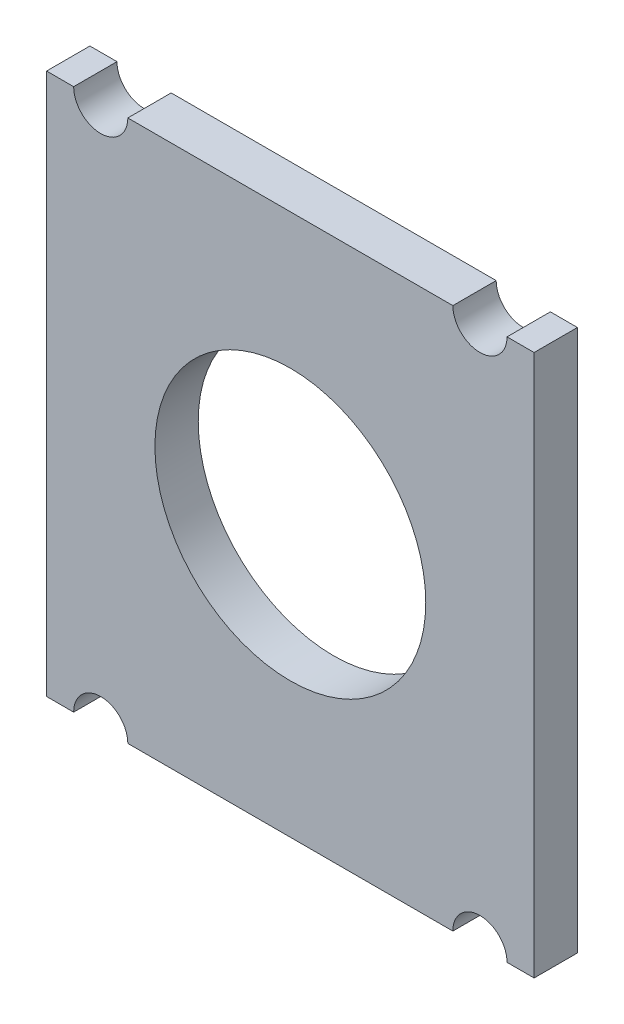
ISO-10303-21;
HEADER;
FILE_DESCRIPTION(('STEP AP214'),'2;1');
FILE_NAME('part.step','',(''),(''),'','','');
FILE_SCHEMA(('AUTOMOTIVE_DESIGN { 1 0 10303 214 1 1 1 1 }'));
ENDSEC;
DATA;
#1=APPLICATION_CONTEXT('core data for automotive mechanical design processes');
#2=APPLICATION_PROTOCOL_DEFINITION('international standard','automotive_design',2000,#1);
#3=PRODUCT_CONTEXT('',#1,'mechanical');
#4=PRODUCT('Part','Part','',(#3));
#5=PRODUCT_RELATED_PRODUCT_CATEGORY('part','',(#4));
#6=PRODUCT_DEFINITION_FORMATION('','',#4);
#7=PRODUCT_DEFINITION_CONTEXT('part definition',#1,'design');
#8=PRODUCT_DEFINITION('design','',#6,#7);
#9=PRODUCT_DEFINITION_SHAPE('','',#8);
#10=(LENGTH_UNIT() NAMED_UNIT(*) SI_UNIT(.MILLI.,.METRE.));
#11=(NAMED_UNIT(*) PLANE_ANGLE_UNIT() SI_UNIT($,.RADIAN.));
#12=(NAMED_UNIT(*) SI_UNIT($,.STERADIAN.) SOLID_ANGLE_UNIT());
#13=UNCERTAINTY_MEASURE_WITH_UNIT(LENGTH_MEASURE(1.E-05),#10,'distance_accuracy_value','');
#14=(GEOMETRIC_REPRESENTATION_CONTEXT(3) GLOBAL_UNCERTAINTY_ASSIGNED_CONTEXT((#13)) GLOBAL_UNIT_ASSIGNED_CONTEXT((#10,
#11,#12)) REPRESENTATION_CONTEXT('',''));
#15=CARTESIAN_POINT('',(0.,0.,0.));
#16=DIRECTION('',(0.,0.,1.));
#17=DIRECTION('',(1.,0.,0.));
#18=AXIS2_PLACEMENT_3D('',#15,#16,#17);
#19=CARTESIAN_POINT('',(9.5,0.,0.8));
#20=DIRECTION('',(0.,1.,0.));
#21=DIRECTION('',(0.,0.,1.));
#22=AXIS2_PLACEMENT_3D('',#19,#20,#21);
#23=PLANE('',#22);
#24=DIRECTION('',(0.,0.,-1.));
#25=VECTOR('',#24,1.);
#26=CARTESIAN_POINT('',(9.,0.,0.8));
#27=LINE('',#26,#25);
#28=CARTESIAN_POINT('',(9.,0.,0.));
#29=VERTEX_POINT('',#28);
#30=CARTESIAN_POINT('',(9.,0.,0.8));
#31=VERTEX_POINT('',#30);
#32=EDGE_CURVE('E120',#29,#31,#27,.F.);
#33=ORIENTED_EDGE('',*,*,#32,.F.);
#34=DIRECTION('',(1.,0.,0.));
#35=VECTOR('',#34,1.);
#36=CARTESIAN_POINT('',(9.5,0.,0.));
#37=LINE('',#36,#35);
#38=CARTESIAN_POINT('',(9.5,0.,0.));
#39=VERTEX_POINT('',#38);
#40=EDGE_CURVE('E188',#29,#39,#37,.T.);
#41=ORIENTED_EDGE('',*,*,#40,.T.);
#42=DIRECTION('',(0.,0.,-1.));
#43=VECTOR('',#42,1.);
#44=CARTESIAN_POINT('',(9.5,0.,0.8));
#45=LINE('',#44,#43);
#46=CARTESIAN_POINT('',(9.5,0.,0.8));
#47=VERTEX_POINT('',#46);
#48=EDGE_CURVE('E146',#47,#39,#45,.T.);
#49=ORIENTED_EDGE('',*,*,#48,.F.);
#50=DIRECTION('',(1.,0.,0.));
#51=VECTOR('',#50,1.);
#52=CARTESIAN_POINT('',(9.5,0.,0.8));
#53=LINE('',#52,#51);
#54=EDGE_CURVE('E138',#31,#47,#53,.T.);
#55=ORIENTED_EDGE('',*,*,#54,.F.);
#56=EDGE_LOOP('',(#33,#41,#49,#55));
#57=FACE_BOUND('',#56,.T.);
#58=ADVANCED_FACE('F33',(#57),#23,.F.);
#59=DIRECTION('',(0.,0.,-1.));
#60=VECTOR('',#59,1.);
#61=CARTESIAN_POINT('',(8.,0.,0.8));
#62=LINE('',#61,#60);
#63=CARTESIAN_POINT('',(8.,0.,0.8));
#64=VERTEX_POINT('',#63);
#65=CARTESIAN_POINT('',(8.,0.,0.));
#66=VERTEX_POINT('',#65);
#67=EDGE_CURVE('E130',#64,#66,#62,.T.);
#68=ORIENTED_EDGE('',*,*,#67,.F.);
#69=CARTESIAN_POINT('',(2.,0.,0.8));
#70=VERTEX_POINT('',#69);
#71=EDGE_CURVE('E142',#70,#64,#53,.T.);
#72=ORIENTED_EDGE('',*,*,#71,.F.);
#73=DIRECTION('',(0.,0.,-1.));
#74=VECTOR('',#73,1.);
#75=CARTESIAN_POINT('',(2.,0.,0.8));
#76=LINE('',#75,#74);
#77=CARTESIAN_POINT('',(2.,0.,0.));
#78=VERTEX_POINT('',#77);
#79=EDGE_CURVE('E200',#78,#70,#76,.F.);
#80=ORIENTED_EDGE('',*,*,#79,.F.);
#81=EDGE_CURVE('E370',#78,#66,#37,.T.);
#82=ORIENTED_EDGE('',*,*,#81,.T.);
#83=EDGE_LOOP('',(#68,#72,#80,#82));
#84=FACE_BOUND('',#83,.T.);
#85=ADVANCED_FACE('F256',(#84),#23,.F.);
#86=CARTESIAN_POINT('',(0.5,10.,0.8));
#87=DIRECTION('',(0.,-1.,0.));
#88=DIRECTION('',(0.,0.,-1.));
#89=AXIS2_PLACEMENT_3D('',#86,#87,#88);
#90=PLANE('',#89);
#91=DIRECTION('',(0.,0.,-1.));
#92=VECTOR('',#91,1.);
#93=CARTESIAN_POINT('',(1.,10.,0.8));
#94=LINE('',#93,#92);
#95=CARTESIAN_POINT('',(1.,10.,0.));
#96=VERTEX_POINT('',#95);
#97=CARTESIAN_POINT('',(1.,10.,0.8));
#98=VERTEX_POINT('',#97);
#99=EDGE_CURVE('E231',#96,#98,#94,.F.);
#100=ORIENTED_EDGE('',*,*,#99,.F.);
#101=DIRECTION('',(-1.,0.,0.));
#102=VECTOR('',#101,1.);
#103=CARTESIAN_POINT('',(0.5,10.,0.));
#104=LINE('',#103,#102);
#105=CARTESIAN_POINT('',(0.5,10.,0.));
#106=VERTEX_POINT('',#105);
#107=EDGE_CURVE('E187',#96,#106,#104,.T.);
#108=ORIENTED_EDGE('',*,*,#107,.T.);
#109=DIRECTION('',(0.,0.,-1.));
#110=VECTOR('',#109,1.);
#111=CARTESIAN_POINT('',(0.5,10.,0.8));
#112=LINE('',#111,#110);
#113=CARTESIAN_POINT('',(0.5,10.,0.8));
#114=VERTEX_POINT('',#113);
#115=EDGE_CURVE('E162',#114,#106,#112,.T.);
#116=ORIENTED_EDGE('',*,*,#115,.F.);
#117=DIRECTION('',(-1.,0.,0.));
#118=VECTOR('',#117,1.);
#119=CARTESIAN_POINT('',(0.5,10.,0.8));
#120=LINE('',#119,#118);
#121=EDGE_CURVE('E207',#98,#114,#120,.T.);
#122=ORIENTED_EDGE('',*,*,#121,.F.);
#123=EDGE_LOOP('',(#100,#108,#116,#122));
#124=FACE_BOUND('',#123,.T.);
#125=ADVANCED_FACE('F215',(#124),#90,.F.);
#126=DIRECTION('',(0.,0.,-1.));
#127=VECTOR('',#126,1.);
#128=CARTESIAN_POINT('',(2.,10.,0.8));
#129=LINE('',#128,#127);
#130=CARTESIAN_POINT('',(2.,10.,0.8));
#131=VERTEX_POINT('',#130);
#132=CARTESIAN_POINT('',(2.,10.,0.));
#133=VERTEX_POINT('',#132);
#134=EDGE_CURVE('E48',#131,#133,#129,.T.);
#135=ORIENTED_EDGE('',*,*,#134,.F.);
#136=CARTESIAN_POINT('',(8.,10.,0.8));
#137=VERTEX_POINT('',#136);
#138=EDGE_CURVE('E208',#137,#131,#120,.T.);
#139=ORIENTED_EDGE('',*,*,#138,.F.);
#140=DIRECTION('',(0.,0.,-1.));
#141=VECTOR('',#140,1.);
#142=CARTESIAN_POINT('',(8.,10.,0.8));
#143=LINE('',#142,#141);
#144=CARTESIAN_POINT('',(8.,10.,0.));
#145=VERTEX_POINT('',#144);
#146=EDGE_CURVE('E235',#145,#137,#143,.F.);
#147=ORIENTED_EDGE('',*,*,#146,.F.);
#148=EDGE_CURVE('E179',#145,#133,#104,.T.);
#149=ORIENTED_EDGE('',*,*,#148,.T.);
#150=EDGE_LOOP('',(#135,#139,#147,#149));
#151=FACE_BOUND('',#150,.T.);
#152=ADVANCED_FACE('F244',(#151),#90,.F.);
#153=DIRECTION('',(0.,0.,-1.));
#154=VECTOR('',#153,1.);
#155=CARTESIAN_POINT('',(9.,10.,0.8));
#156=LINE('',#155,#154);
#157=CARTESIAN_POINT('',(9.,10.,0.8));
#158=VERTEX_POINT('',#157);
#159=CARTESIAN_POINT('',(9.,10.,0.));
#160=VERTEX_POINT('',#159);
#161=EDGE_CURVE('E55',#158,#160,#156,.T.);
#162=ORIENTED_EDGE('',*,*,#161,.F.);
#163=CARTESIAN_POINT('',(9.5,10.,0.8));
#164=VERTEX_POINT('',#163);
#165=EDGE_CURVE('E151',#164,#158,#120,.T.);
#166=ORIENTED_EDGE('',*,*,#165,.F.);
#167=DIRECTION('',(0.,0.,-1.));
#168=VECTOR('',#167,1.);
#169=CARTESIAN_POINT('',(9.5,10.,0.8));
#170=LINE('',#169,#168);
#171=CARTESIAN_POINT('',(9.5,10.,0.));
#172=VERTEX_POINT('',#171);
#173=EDGE_CURVE('E170',#164,#172,#170,.T.);
#174=ORIENTED_EDGE('',*,*,#173,.T.);
#175=EDGE_CURVE('E177',#172,#160,#104,.T.);
#176=ORIENTED_EDGE('',*,*,#175,.T.);
#177=EDGE_LOOP('',(#162,#166,#174,#176));
#178=FACE_BOUND('',#177,.T.);
#179=ADVANCED_FACE('F182',(#178),#90,.F.);
#180=DIRECTION('',(0.,0.,-1.));
#181=VECTOR('',#180,1.);
#182=CARTESIAN_POINT('',(1.,0.,0.8));
#183=LINE('',#182,#181);
#184=CARTESIAN_POINT('',(1.,0.,0.8));
#185=VERTEX_POINT('',#184);
#186=CARTESIAN_POINT('',(1.,0.,0.));
#187=VERTEX_POINT('',#186);
#188=EDGE_CURVE('E224',#185,#187,#183,.T.);
#189=ORIENTED_EDGE('',*,*,#188,.F.);
#190=CARTESIAN_POINT('',(0.5,0.,0.8));
#191=VERTEX_POINT('',#190);
#192=EDGE_CURVE('E150',#191,#185,#53,.T.);
#193=ORIENTED_EDGE('',*,*,#192,.F.);
#194=DIRECTION('',(0.,0.,-1.));
#195=VECTOR('',#194,1.);
#196=CARTESIAN_POINT('',(0.5,0.,0.8));
#197=LINE('',#196,#195);
#198=CARTESIAN_POINT('',(0.5,0.,0.));
#199=VERTEX_POINT('',#198);
#200=EDGE_CURVE('E156',#191,#199,#197,.T.);
#201=ORIENTED_EDGE('',*,*,#200,.T.);
#202=EDGE_CURVE('E165',#199,#187,#37,.T.);
#203=ORIENTED_EDGE('',*,*,#202,.T.);
#204=EDGE_LOOP('',(#189,#193,#201,#203));
#205=FACE_BOUND('',#204,.T.);
#206=ADVANCED_FACE('F223',(#205),#23,.F.);
#207=CARTESIAN_POINT('',(9.5,10.,0.8));
#208=DIRECTION('',(-1.,0.,0.));
#209=DIRECTION('',(0.,0.,1.));
#210=AXIS2_PLACEMENT_3D('',#207,#208,#209);
#211=PLANE('',#210);
#212=DIRECTION('',(0.,1.,0.));
#213=VECTOR('',#212,1.);
#214=CARTESIAN_POINT('',(9.5,10.,0.));
#215=LINE('',#214,#213);
#216=EDGE_CURVE('E189',#39,#172,#215,.T.);
#217=ORIENTED_EDGE('',*,*,#216,.T.);
#218=ORIENTED_EDGE('',*,*,#173,.F.);
#219=DIRECTION('',(0.,1.,0.));
#220=VECTOR('',#219,1.);
#221=CARTESIAN_POINT('',(9.5,10.,0.8));
#222=LINE('',#221,#220);
#223=EDGE_CURVE('E205',#47,#164,#222,.T.);
#224=ORIENTED_EDGE('',*,*,#223,.F.);
#225=ORIENTED_EDGE('',*,*,#48,.T.);
#226=EDGE_LOOP('',(#217,#218,#224,#225));
#227=FACE_BOUND('',#226,.T.);
#228=ADVANCED_FACE('F35',(#227),#211,.F.);
#229=CARTESIAN_POINT('',(0.5,0.,0.8));
#230=DIRECTION('',(1.,0.,0.));
#231=DIRECTION('',(0.,0.,-1.));
#232=AXIS2_PLACEMENT_3D('',#229,#230,#231);
#233=PLANE('',#232);
#234=DIRECTION('',(0.,-1.,0.));
#235=VECTOR('',#234,1.);
#236=CARTESIAN_POINT('',(0.5,0.,0.));
#237=LINE('',#236,#235);
#238=EDGE_CURVE('E185',#106,#199,#237,.T.);
#239=ORIENTED_EDGE('',*,*,#238,.T.);
#240=ORIENTED_EDGE('',*,*,#200,.F.);
#241=DIRECTION('',(0.,-1.,0.));
#242=VECTOR('',#241,1.);
#243=CARTESIAN_POINT('',(0.5,0.,0.8));
#244=LINE('',#243,#242);
#245=EDGE_CURVE('E148',#114,#191,#244,.T.);
#246=ORIENTED_EDGE('',*,*,#245,.F.);
#247=ORIENTED_EDGE('',*,*,#115,.T.);
#248=EDGE_LOOP('',(#239,#240,#246,#247));
#249=FACE_BOUND('',#248,.T.);
#250=ADVANCED_FACE('F218',(#249),#233,.F.);
#251=CARTESIAN_POINT('',(0.,0.,0.8));
#252=DIRECTION('',(0.,0.,-1.));
#253=DIRECTION('',(-1.,0.,0.));
#254=AXIS2_PLACEMENT_3D('',#251,#252,#253);
#255=PLANE('',#254);
#256=CARTESIAN_POINT('',(1.5,10.,0.8));
#257=DIRECTION('',(0.,0.,1.));
#258=DIRECTION('',(1.,0.,0.));
#259=AXIS2_PLACEMENT_3D('',#256,#257,#258);
#260=CIRCLE('',#259,0.5);
#261=EDGE_CURVE('E214',#98,#131,#260,.T.);
#262=ORIENTED_EDGE('',*,*,#261,.F.);
#263=ORIENTED_EDGE('',*,*,#121,.T.);
#264=ORIENTED_EDGE('',*,*,#245,.T.);
#265=ORIENTED_EDGE('',*,*,#192,.T.);
#266=CARTESIAN_POINT('',(1.5,0.,0.8));
#267=DIRECTION('',(0.,0.,1.));
#268=DIRECTION('',(1.,0.,0.));
#269=AXIS2_PLACEMENT_3D('',#266,#267,#268);
#270=CIRCLE('',#269,0.5);
#271=EDGE_CURVE('E227',#70,#185,#270,.T.);
#272=ORIENTED_EDGE('',*,*,#271,.F.);
#273=ORIENTED_EDGE('',*,*,#71,.T.);
#274=CARTESIAN_POINT('',(8.5,0.,0.8));
#275=DIRECTION('',(0.,0.,1.));
#276=DIRECTION('',(1.,0.,0.));
#277=AXIS2_PLACEMENT_3D('',#274,#275,#276);
#278=CIRCLE('',#277,0.5);
#279=EDGE_CURVE('E123',#31,#64,#278,.T.);
#280=ORIENTED_EDGE('',*,*,#279,.F.);
#281=ORIENTED_EDGE('',*,*,#54,.T.);
#282=ORIENTED_EDGE('',*,*,#223,.T.);
#283=ORIENTED_EDGE('',*,*,#165,.T.);
#284=CARTESIAN_POINT('',(8.5,10.,0.8));
#285=DIRECTION('',(0.,0.,1.));
#286=DIRECTION('',(1.,0.,0.));
#287=AXIS2_PLACEMENT_3D('',#284,#285,#286);
#288=CIRCLE('',#287,0.5);
#289=EDGE_CURVE('E143',#137,#158,#288,.T.);
#290=ORIENTED_EDGE('',*,*,#289,.F.);
#291=ORIENTED_EDGE('',*,*,#138,.T.);
#292=EDGE_LOOP('',(#262,#263,#264,#265,#272,#273,#280,#281,#282,#283,#290,#291));
#293=FACE_BOUND('',#292,.T.);
#294=CARTESIAN_POINT('',(5.,5.,0.8));
#295=DIRECTION('',(0.,0.,1.));
#296=DIRECTION('',(1.,0.,0.));
#297=AXIS2_PLACEMENT_3D('',#294,#295,#296);
#298=CIRCLE('',#297,2.5);
#299=CARTESIAN_POINT('',(7.5,5.,0.8));
#300=VERTEX_POINT('',#299);
#301=EDGE_CURVE('E193',#300,#300,#298,.T.);
#302=ORIENTED_EDGE('',*,*,#301,.F.);
#303=EDGE_LOOP('',(#302));
#304=FACE_BOUND('',#303,.T.);
#305=ADVANCED_FACE('F135',(#293,#304),#255,.F.);
#306=CARTESIAN_POINT('',(0.,0.,0.));
#307=DIRECTION('',(0.,0.,-1.));
#308=DIRECTION('',(-1.,0.,0.));
#309=AXIS2_PLACEMENT_3D('',#306,#307,#308);
#310=PLANE('',#309);
#311=CARTESIAN_POINT('',(5.,5.,0.));
#312=DIRECTION('',(0.,0.,1.));
#313=DIRECTION('',(1.,0.,0.));
#314=AXIS2_PLACEMENT_3D('',#311,#312,#313);
#315=CIRCLE('',#314,2.5);
#316=CARTESIAN_POINT('',(7.5,5.,0.));
#317=VERTEX_POINT('',#316);
#318=EDGE_CURVE('E195',#317,#317,#315,.T.);
#319=ORIENTED_EDGE('',*,*,#318,.T.);
#320=EDGE_LOOP('',(#319));
#321=FACE_BOUND('',#320,.T.);
#322=ORIENTED_EDGE('',*,*,#107,.F.);
#323=CARTESIAN_POINT('',(1.5,10.,0.));
#324=DIRECTION('',(0.,0.,-1.));
#325=DIRECTION('',(-1.,0.,0.));
#326=AXIS2_PLACEMENT_3D('',#323,#324,#325);
#327=CIRCLE('',#326,0.5);
#328=EDGE_CURVE('E11',#96,#133,#327,.F.);
#329=ORIENTED_EDGE('',*,*,#328,.T.);
#330=ORIENTED_EDGE('',*,*,#148,.F.);
#331=CARTESIAN_POINT('',(8.5,10.,0.));
#332=DIRECTION('',(0.,0.,-1.));
#333=DIRECTION('',(-1.,0.,0.));
#334=AXIS2_PLACEMENT_3D('',#331,#332,#333);
#335=CIRCLE('',#334,0.5);
#336=EDGE_CURVE('E41',#145,#160,#335,.F.);
#337=ORIENTED_EDGE('',*,*,#336,.T.);
#338=ORIENTED_EDGE('',*,*,#175,.F.);
#339=ORIENTED_EDGE('',*,*,#216,.F.);
#340=ORIENTED_EDGE('',*,*,#40,.F.);
#341=CARTESIAN_POINT('',(8.5,0.,0.));
#342=DIRECTION('',(0.,0.,1.));
#343=DIRECTION('',(1.,0.,0.));
#344=AXIS2_PLACEMENT_3D('',#341,#342,#343);
#345=CIRCLE('',#344,0.5);
#346=EDGE_CURVE('E126',#29,#66,#345,.T.);
#347=ORIENTED_EDGE('',*,*,#346,.T.);
#348=ORIENTED_EDGE('',*,*,#81,.F.);
#349=CARTESIAN_POINT('',(1.5,0.,0.));
#350=DIRECTION('',(0.,0.,1.));
#351=DIRECTION('',(1.,0.,0.));
#352=AXIS2_PLACEMENT_3D('',#349,#350,#351);
#353=CIRCLE('',#352,0.5);
#354=EDGE_CURVE('E228',#78,#187,#353,.T.);
#355=ORIENTED_EDGE('',*,*,#354,.T.);
#356=ORIENTED_EDGE('',*,*,#202,.F.);
#357=ORIENTED_EDGE('',*,*,#238,.F.);
#358=EDGE_LOOP('',(#322,#329,#330,#337,#338,#339,#340,#347,#348,#355,#356,#357));
#359=FACE_BOUND('',#358,.T.);
#360=ADVANCED_FACE('F176',(#321,#359),#310,.T.);
#361=CARTESIAN_POINT('',(5.,5.,0.8));
#362=DIRECTION('',(0.,0.,-1.));
#363=DIRECTION('',(-1.,0.,0.));
#364=AXIS2_PLACEMENT_3D('',#361,#362,#363);
#365=CYLINDRICAL_SURFACE('',#364,2.5);
#366=ORIENTED_EDGE('',*,*,#301,.T.);
#367=EDGE_LOOP('',(#366));
#368=FACE_BOUND('',#367,.T.);
#369=ORIENTED_EDGE('',*,*,#318,.F.);
#370=EDGE_LOOP('',(#369));
#371=FACE_BOUND('',#370,.T.);
#372=ADVANCED_FACE('F309',(#368,#371),#365,.F.);
#373=CARTESIAN_POINT('',(1.5,0.,0.8));
#374=DIRECTION('',(0.,0.,-1.));
#375=DIRECTION('',(-1.,0.,0.));
#376=AXIS2_PLACEMENT_3D('',#373,#374,#375);
#377=CYLINDRICAL_SURFACE('',#376,0.5);
#378=ORIENTED_EDGE('',*,*,#79,.T.);
#379=ORIENTED_EDGE('',*,*,#271,.T.);
#380=ORIENTED_EDGE('',*,*,#188,.T.);
#381=ORIENTED_EDGE('',*,*,#354,.F.);
#382=EDGE_LOOP('',(#378,#379,#380,#381));
#383=FACE_BOUND('',#382,.T.);
#384=ADVANCED_FACE('F253',(#383),#377,.F.);
#385=CARTESIAN_POINT('',(8.5,0.,0.8));
#386=DIRECTION('',(0.,0.,-1.));
#387=DIRECTION('',(-1.,0.,0.));
#388=AXIS2_PLACEMENT_3D('',#385,#386,#387);
#389=CYLINDRICAL_SURFACE('',#388,0.5);
#390=ORIENTED_EDGE('',*,*,#32,.T.);
#391=ORIENTED_EDGE('',*,*,#279,.T.);
#392=ORIENTED_EDGE('',*,*,#67,.T.);
#393=ORIENTED_EDGE('',*,*,#346,.F.);
#394=EDGE_LOOP('',(#390,#391,#392,#393));
#395=FACE_BOUND('',#394,.T.);
#396=ADVANCED_FACE('F122',(#395),#389,.F.);
#397=CARTESIAN_POINT('',(8.5,10.,0.8));
#398=DIRECTION('',(0.,0.,-1.));
#399=DIRECTION('',(-1.,0.,0.));
#400=AXIS2_PLACEMENT_3D('',#397,#398,#399);
#401=CYLINDRICAL_SURFACE('',#400,0.5);
#402=ORIENTED_EDGE('',*,*,#146,.T.);
#403=ORIENTED_EDGE('',*,*,#289,.T.);
#404=ORIENTED_EDGE('',*,*,#161,.T.);
#405=ORIENTED_EDGE('',*,*,#336,.F.);
#406=EDGE_LOOP('',(#402,#403,#404,#405));
#407=FACE_BOUND('',#406,.T.);
#408=ADVANCED_FACE('F245',(#407),#401,.F.);
#409=CARTESIAN_POINT('',(1.5,10.,0.8));
#410=DIRECTION('',(0.,0.,-1.));
#411=DIRECTION('',(-1.,0.,0.));
#412=AXIS2_PLACEMENT_3D('',#409,#410,#411);
#413=CYLINDRICAL_SURFACE('',#412,0.5);
#414=ORIENTED_EDGE('',*,*,#99,.T.);
#415=ORIENTED_EDGE('',*,*,#261,.T.);
#416=ORIENTED_EDGE('',*,*,#134,.T.);
#417=ORIENTED_EDGE('',*,*,#328,.F.);
#418=EDGE_LOOP('',(#414,#415,#416,#417));
#419=FACE_BOUND('',#418,.T.);
#420=ADVANCED_FACE('F241',(#419),#413,.F.);
#421=CLOSED_SHELL('',(#58,#85,#125,#152,#179,#206,#228,#250,#305,#360,#372,#384,#396,#408,#420));
#422=MANIFOLD_SOLID_BREP('B2',#421);
#423=ADVANCED_BREP_SHAPE_REPRESENTATION('',(#18,#422),#14);
#424=SHAPE_DEFINITION_REPRESENTATION(#9,#423);
ENDSEC;
END-ISO-10303-21;
